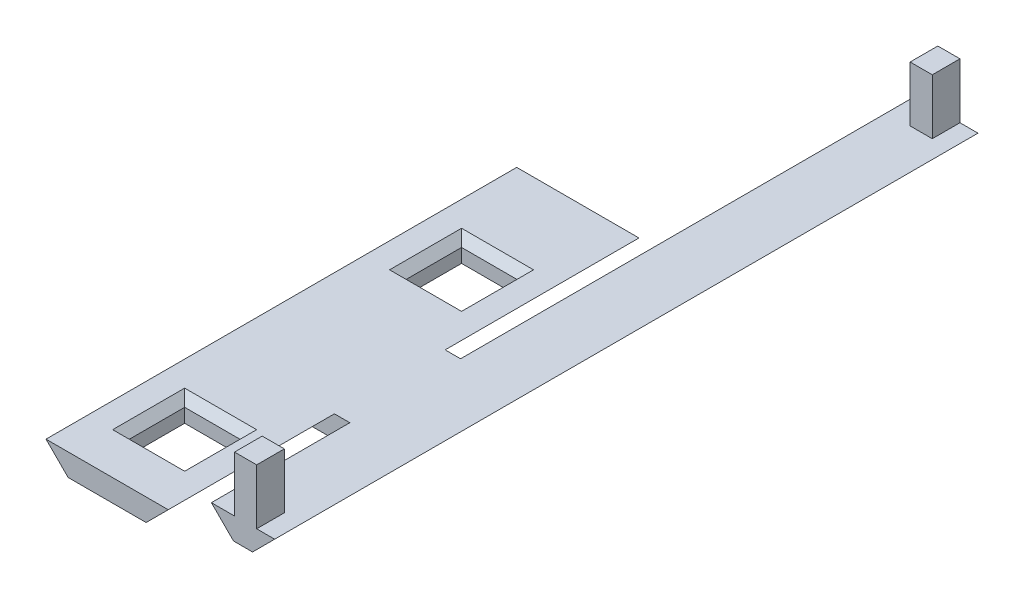
ISO-10303-21;
HEADER;
FILE_DESCRIPTION(('STEP AP214'),'2;1');
FILE_NAME('part.step','',(''),(''),'','','');
FILE_SCHEMA(('AUTOMOTIVE_DESIGN { 1 0 10303 214 1 1 1 1 }'));
ENDSEC;
DATA;
#1=APPLICATION_CONTEXT('core data for automotive mechanical design processes');
#2=APPLICATION_PROTOCOL_DEFINITION('international standard','automotive_design',2000,#1);
#3=PRODUCT_CONTEXT('',#1,'mechanical');
#4=PRODUCT('Part','Part','',(#3));
#5=PRODUCT_RELATED_PRODUCT_CATEGORY('part','',(#4));
#6=PRODUCT_DEFINITION_FORMATION('','',#4);
#7=PRODUCT_DEFINITION_CONTEXT('part definition',#1,'design');
#8=PRODUCT_DEFINITION('design','',#6,#7);
#9=PRODUCT_DEFINITION_SHAPE('','',#8);
#10=(LENGTH_UNIT() NAMED_UNIT(*) SI_UNIT(.MILLI.,.METRE.));
#11=(NAMED_UNIT(*) PLANE_ANGLE_UNIT() SI_UNIT($,.RADIAN.));
#12=(NAMED_UNIT(*) SI_UNIT($,.STERADIAN.) SOLID_ANGLE_UNIT());
#13=UNCERTAINTY_MEASURE_WITH_UNIT(LENGTH_MEASURE(1.E-05),#10,'distance_accuracy_value','');
#14=(GEOMETRIC_REPRESENTATION_CONTEXT(3) GLOBAL_UNCERTAINTY_ASSIGNED_CONTEXT((#13)) GLOBAL_UNIT_ASSIGNED_CONTEXT((#10,
#11,#12)) REPRESENTATION_CONTEXT('',''));
#15=CARTESIAN_POINT('',(0.,0.,0.));
#16=DIRECTION('',(0.,0.,1.));
#17=DIRECTION('',(1.,0.,0.));
#18=AXIS2_PLACEMENT_3D('',#15,#16,#17);
#19=CARTESIAN_POINT('',(0.,4.,85.));
#20=DIRECTION('',(0.,1.,0.));
#21=DIRECTION('',(-1.,0.,0.));
#22=AXIS2_PLACEMENT_3D('',#19,#20,#21);
#23=PLANE('',#22);
#24=DIRECTION('',(1.,0.,0.));
#25=VECTOR('',#24,1.);
#26=CARTESIAN_POINT('',(5.46065409578525,4.,14.5));
#27=LINE('',#26,#25);
#28=CARTESIAN_POINT('',(-6.0393459042148,4.,14.5));
#29=VERTEX_POINT('',#28);
#30=CARTESIAN_POINT('',(6.96065409578529,4.,14.5));
#31=VERTEX_POINT('',#30);
#32=EDGE_CURVE('E460',#29,#31,#27,.T.);
#33=ORIENTED_EDGE('',*,*,#32,.T.);
#34=DIRECTION('',(0.,0.,1.));
#35=VECTOR('',#34,1.);
#36=CARTESIAN_POINT('',(6.96065409578529,4.,26.));
#37=LINE('',#36,#35);
#38=CARTESIAN_POINT('',(6.96065409578529,4.,27.5));
#39=VERTEX_POINT('',#38);
#40=EDGE_CURVE('E462',#31,#39,#37,.T.);
#41=ORIENTED_EDGE('',*,*,#40,.T.);
#42=DIRECTION('',(-1.,0.,0.));
#43=VECTOR('',#42,1.);
#44=CARTESIAN_POINT('',(-4.53934590421476,4.,27.5));
#45=LINE('',#44,#43);
#46=CARTESIAN_POINT('',(-6.0393459042148,4.,27.5));
#47=VERTEX_POINT('',#46);
#48=EDGE_CURVE('E456',#39,#47,#45,.T.);
#49=ORIENTED_EDGE('',*,*,#48,.T.);
#50=DIRECTION('',(0.,0.,-1.));
#51=VECTOR('',#50,1.);
#52=CARTESIAN_POINT('',(-6.0393459042148,4.,16.));
#53=LINE('',#52,#51);
#54=EDGE_CURVE('E458',#47,#29,#53,.T.);
#55=ORIENTED_EDGE('',*,*,#54,.T.);
#56=EDGE_LOOP('',(#33,#41,#49,#55));
#57=FACE_BOUND('',#56,.T.);
#58=DIRECTION('',(0.,0.,-1.));
#59=VECTOR('',#58,1.);
#60=CARTESIAN_POINT('',(-6.03934590421478,4.,66.));
#61=LINE('',#60,#59);
#62=CARTESIAN_POINT('',(-6.03934590421478,4.,77.5));
#63=VERTEX_POINT('',#62);
#64=CARTESIAN_POINT('',(-6.03934590421478,4.,64.5));
#65=VERTEX_POINT('',#64);
#66=EDGE_CURVE('E447',#63,#65,#61,.T.);
#67=ORIENTED_EDGE('',*,*,#66,.T.);
#68=DIRECTION('',(1.,0.,0.));
#69=VECTOR('',#68,1.);
#70=CARTESIAN_POINT('',(5.46065409578524,4.,64.5));
#71=LINE('',#70,#69);
#72=CARTESIAN_POINT('',(6.96065409578526,4.,64.5));
#73=VERTEX_POINT('',#72);
#74=EDGE_CURVE('E453',#65,#73,#71,.T.);
#75=ORIENTED_EDGE('',*,*,#74,.T.);
#76=DIRECTION('',(0.,0.,1.));
#77=VECTOR('',#76,1.);
#78=CARTESIAN_POINT('',(6.96065409578525,4.,76.));
#79=LINE('',#78,#77);
#80=CARTESIAN_POINT('',(6.96065409578525,4.,77.5));
#81=VERTEX_POINT('',#80);
#82=EDGE_CURVE('E451',#73,#81,#79,.T.);
#83=ORIENTED_EDGE('',*,*,#82,.T.);
#84=DIRECTION('',(-1.,0.,0.));
#85=VECTOR('',#84,1.);
#86=CARTESIAN_POINT('',(-4.53934590421476,4.,77.5));
#87=LINE('',#86,#85);
#88=EDGE_CURVE('E449',#81,#63,#87,.T.);
#89=ORIENTED_EDGE('',*,*,#88,.T.);
#90=EDGE_LOOP('',(#67,#75,#83,#89));
#91=FACE_BOUND('',#90,.T.);
#92=DIRECTION('',(1.,0.,0.));
#93=VECTOR('',#92,1.);
#94=CARTESIAN_POINT('',(22.4606540957852,4.,-42.));
#95=LINE('',#94,#93);
#96=CARTESIAN_POINT('',(18.4606540957852,4.,-42.));
#97=VERTEX_POINT('',#96);
#98=CARTESIAN_POINT('',(22.4606540957852,4.,-42.));
#99=VERTEX_POINT('',#98);
#100=EDGE_CURVE('E961',#97,#99,#95,.T.);
#101=ORIENTED_EDGE('',*,*,#100,.F.);
#102=DIRECTION('',(0.,0.,1.));
#103=VECTOR('',#102,1.);
#104=CARTESIAN_POINT('',(18.4606540957852,4.,-42.));
#105=LINE('',#104,#103);
#106=CARTESIAN_POINT('',(18.4606540957852,4.,-47.));
#107=VERTEX_POINT('',#106);
#108=EDGE_CURVE('E275',#107,#97,#105,.T.);
#109=ORIENTED_EDGE('',*,*,#108,.F.);
#110=DIRECTION('',(1.,0.,0.));
#111=VECTOR('',#110,1.);
#112=CARTESIAN_POINT('',(0.,4.,-47.));
#113=LINE('',#112,#111);
#114=CARTESIAN_POINT('',(14.2828427124745,4.,-47.));
#115=VERTEX_POINT('',#114);
#116=EDGE_CURVE('E327',#115,#107,#113,.T.);
#117=ORIENTED_EDGE('',*,*,#116,.F.);
#118=DIRECTION('',(0.,0.,1.));
#119=VECTOR('',#118,1.);
#120=CARTESIAN_POINT('',(14.2828427124745,4.,-47.));
#121=LINE('',#120,#119);
#122=CARTESIAN_POINT('',(14.2828427124745,4.,35.));
#123=VERTEX_POINT('',#122);
#124=EDGE_CURVE('E344',#115,#123,#121,.T.);
#125=ORIENTED_EDGE('',*,*,#124,.T.);
#126=DIRECTION('',(1.,0.,0.));
#127=VECTOR('',#126,1.);
#128=CARTESIAN_POINT('',(7.5,4.,35.));
#129=LINE('',#128,#127);
#130=CARTESIAN_POINT('',(11.5,4.,35.));
#131=VERTEX_POINT('',#130);
#132=EDGE_CURVE('E356',#131,#123,#129,.T.);
#133=ORIENTED_EDGE('',*,*,#132,.F.);
#134=DIRECTION('',(0.,0.,-1.));
#135=VECTOR('',#134,1.);
#136=CARTESIAN_POINT('',(11.5,4.,85.));
#137=LINE('',#136,#135);
#138=CARTESIAN_POINT('',(11.5,4.,0.));
#139=VERTEX_POINT('',#138);
#140=EDGE_CURVE('E437',#131,#139,#137,.T.);
#141=ORIENTED_EDGE('',*,*,#140,.T.);
#142=DIRECTION('',(1.,0.,0.));
#143=VECTOR('',#142,1.);
#144=CARTESIAN_POINT('',(0.,4.,0.));
#145=LINE('',#144,#143);
#146=CARTESIAN_POINT('',(-10.5786918084295,4.,0.));
#147=VERTEX_POINT('',#146);
#148=EDGE_CURVE('E429',#147,#139,#145,.T.);
#149=ORIENTED_EDGE('',*,*,#148,.F.);
#150=DIRECTION('',(0.,0.,-1.));
#151=VECTOR('',#150,1.);
#152=CARTESIAN_POINT('',(-10.5786918084295,4.,85.));
#153=LINE('',#152,#151);
#154=CARTESIAN_POINT('',(-10.5786918084295,4.,85.));
#155=VERTEX_POINT('',#154);
#156=EDGE_CURVE('E435',#155,#147,#153,.T.);
#157=ORIENTED_EDGE('',*,*,#156,.F.);
#158=DIRECTION('',(1.,0.,0.));
#159=VECTOR('',#158,1.);
#160=CARTESIAN_POINT('',(0.,4.,85.));
#161=LINE('',#160,#159);
#162=CARTESIAN_POINT('',(11.5,4.,85.));
#163=VERTEX_POINT('',#162);
#164=EDGE_CURVE('E418',#155,#163,#161,.T.);
#165=ORIENTED_EDGE('',*,*,#164,.T.);
#166=CARTESIAN_POINT('',(11.5,4.,55.));
#167=VERTEX_POINT('',#166);
#168=EDGE_CURVE('E438',#163,#167,#137,.T.);
#169=ORIENTED_EDGE('',*,*,#168,.T.);
#170=DIRECTION('',(-1.,0.,0.));
#171=VECTOR('',#170,1.);
#172=CARTESIAN_POINT('',(7.5,4.,55.));
#173=LINE('',#172,#171);
#174=CARTESIAN_POINT('',(14.2828427124745,4.,55.));
#175=VERTEX_POINT('',#174);
#176=EDGE_CURVE('E358',#175,#167,#173,.T.);
#177=ORIENTED_EDGE('',*,*,#176,.F.);
#178=CARTESIAN_POINT('',(14.2828427124745,4.,80.));
#179=VERTEX_POINT('',#178);
#180=EDGE_CURVE('E347',#175,#179,#121,.T.);
#181=ORIENTED_EDGE('',*,*,#180,.T.);
#182=DIRECTION('',(1.,0.,0.));
#183=VECTOR('',#182,1.);
#184=CARTESIAN_POINT('',(0.,4.,80.));
#185=LINE('',#184,#183);
#186=CARTESIAN_POINT('',(18.4606540957852,4.,80.));
#187=VERTEX_POINT('',#186);
#188=EDGE_CURVE('E316',#179,#187,#185,.T.);
#189=ORIENTED_EDGE('',*,*,#188,.T.);
#190=DIRECTION('',(0.,0.,-1.));
#191=VECTOR('',#190,1.);
#192=CARTESIAN_POINT('',(18.4606540957852,4.,0.));
#193=LINE('',#192,#191);
#194=CARTESIAN_POINT('',(18.4606540957852,4.,75.));
#195=VERTEX_POINT('',#194);
#196=EDGE_CURVE('E290',#187,#195,#193,.T.);
#197=ORIENTED_EDGE('',*,*,#196,.T.);
#198=DIRECTION('',(1.,0.,0.));
#199=VECTOR('',#198,1.);
#200=CARTESIAN_POINT('',(0.,4.,75.));
#201=LINE('',#200,#199);
#202=CARTESIAN_POINT('',(22.4606540957852,4.,75.));
#203=VERTEX_POINT('',#202);
#204=EDGE_CURVE('E280',#195,#203,#201,.T.);
#205=ORIENTED_EDGE('',*,*,#204,.T.);
#206=DIRECTION('',(0.,0.,-1.));
#207=VECTOR('',#206,1.);
#208=CARTESIAN_POINT('',(22.4606540957851,4.,0.));
#209=LINE('',#208,#207);
#210=CARTESIAN_POINT('',(22.4606540957852,4.,80.));
#211=VERTEX_POINT('',#210);
#212=EDGE_CURVE('E277',#211,#203,#209,.T.);
#213=ORIENTED_EDGE('',*,*,#212,.F.);
#214=CARTESIAN_POINT('',(25.7171572875254,4.,80.));
#215=VERTEX_POINT('',#214);
#216=EDGE_CURVE('E315',#211,#215,#185,.T.);
#217=ORIENTED_EDGE('',*,*,#216,.T.);
#218=DIRECTION('',(0.,0.,1.));
#219=VECTOR('',#218,1.);
#220=CARTESIAN_POINT('',(25.7171572875254,4.,-47.));
#221=LINE('',#220,#219);
#222=CARTESIAN_POINT('',(25.7171572875254,4.,-47.));
#223=VERTEX_POINT('',#222);
#224=EDGE_CURVE('E336',#223,#215,#221,.T.);
#225=ORIENTED_EDGE('',*,*,#224,.F.);
#226=CARTESIAN_POINT('',(22.4606540957852,4.,-47.));
#227=VERTEX_POINT('',#226);
#228=EDGE_CURVE('E326',#227,#223,#113,.T.);
#229=ORIENTED_EDGE('',*,*,#228,.F.);
#230=DIRECTION('',(0.,0.,-1.));
#231=VECTOR('',#230,1.);
#232=CARTESIAN_POINT('',(22.4606540957852,4.,-42.));
#233=LINE('',#232,#231);
#234=EDGE_CURVE('E271',#99,#227,#233,.T.);
#235=ORIENTED_EDGE('',*,*,#234,.F.);
#236=EDGE_LOOP('',(#101,#109,#117,#125,#133,#141,#149,#157,#165,#169,#177,#181,#189,#197,#205,
#213,#217,#225,#229,#235));
#237=FACE_BOUND('',#236,.T.);
#238=ADVANCED_FACE('F43',(#57,#91,#237),#23,.T.);
#239=CARTESIAN_POINT('',(3.75000000000001,-3.75,85.));
#240=DIRECTION('',(-0.707106781186549,0.707106781186546,0.));
#241=DIRECTION('',(-0.707106781186546,-0.707106781186549,0.));
#242=AXIS2_PLACEMENT_3D('',#239,#240,#241);
#243=PLANE('',#242);
#244=DIRECTION('',(0.,0.,-1.));
#245=VECTOR('',#244,1.);
#246=CARTESIAN_POINT('',(7.5,0.,85.));
#247=LINE('',#246,#245);
#248=CARTESIAN_POINT('',(7.5,0.,85.));
#249=VERTEX_POINT('',#248);
#250=CARTESIAN_POINT('',(7.5,0.,55.));
#251=VERTEX_POINT('',#250);
#252=EDGE_CURVE('E442',#249,#251,#247,.T.);
#253=ORIENTED_EDGE('',*,*,#252,.T.);
#254=DIRECTION('',(0.707106781186546,0.707106781186549,0.));
#255=VECTOR('',#254,1.);
#256=CARTESIAN_POINT('',(3.75000000000001,-3.75,55.));
#257=LINE('',#256,#255);
#258=EDGE_CURVE('E368',#251,#167,#257,.T.);
#259=ORIENTED_EDGE('',*,*,#258,.T.);
#260=ORIENTED_EDGE('',*,*,#168,.F.);
#261=DIRECTION('',(0.707106781186546,0.707106781186549,0.));
#262=VECTOR('',#261,1.);
#263=CARTESIAN_POINT('',(3.75000000000001,-3.75,85.));
#264=LINE('',#263,#262);
#265=EDGE_CURVE('E415',#249,#163,#264,.T.);
#266=ORIENTED_EDGE('',*,*,#265,.F.);
#267=EDGE_LOOP('',(#253,#259,#260,#266));
#268=FACE_BOUND('',#267,.T.);
#269=ADVANCED_FACE('F539',(#268),#243,.F.);
#270=CARTESIAN_POINT('',(0.,0.,85.));
#271=DIRECTION('',(0.,-1.,0.));
#272=DIRECTION('',(0.,0.,-1.));
#273=AXIS2_PLACEMENT_3D('',#270,#271,#272);
#274=PLANE('',#273);
#275=DIRECTION('',(0.,0.,1.));
#276=VECTOR('',#275,1.);
#277=CARTESIAN_POINT('',(5.46065409578525,0.,26.));
#278=LINE('',#277,#276);
#279=CARTESIAN_POINT('',(5.46065409578525,0.,16.));
#280=VERTEX_POINT('',#279);
#281=CARTESIAN_POINT('',(5.46065409578525,0.,26.));
#282=VERTEX_POINT('',#281);
#283=EDGE_CURVE('E372',#280,#282,#278,.T.);
#284=ORIENTED_EDGE('',*,*,#283,.F.);
#285=DIRECTION('',(1.,0.,0.));
#286=VECTOR('',#285,1.);
#287=CARTESIAN_POINT('',(-4.53934590421475,0.,16.));
#288=LINE('',#287,#286);
#289=CARTESIAN_POINT('',(-4.53934590421475,0.,16.));
#290=VERTEX_POINT('',#289);
#291=EDGE_CURVE('E382',#290,#280,#288,.T.);
#292=ORIENTED_EDGE('',*,*,#291,.F.);
#293=DIRECTION('',(0.,0.,-1.));
#294=VECTOR('',#293,1.);
#295=CARTESIAN_POINT('',(-4.53934590421476,0.,26.));
#296=LINE('',#295,#294);
#297=CARTESIAN_POINT('',(-4.53934590421476,0.,26.));
#298=VERTEX_POINT('',#297);
#299=EDGE_CURVE('E379',#298,#290,#296,.T.);
#300=ORIENTED_EDGE('',*,*,#299,.F.);
#301=DIRECTION('',(-1.,0.,0.));
#302=VECTOR('',#301,1.);
#303=CARTESIAN_POINT('',(-4.53934590421476,0.,26.));
#304=LINE('',#303,#302);
#305=EDGE_CURVE('E375',#282,#298,#304,.T.);
#306=ORIENTED_EDGE('',*,*,#305,.F.);
#307=EDGE_LOOP('',(#284,#292,#300,#306));
#308=FACE_BOUND('',#307,.T.);
#309=DIRECTION('',(0.,0.,1.));
#310=VECTOR('',#309,1.);
#311=CARTESIAN_POINT('',(5.46065409578524,0.,76.));
#312=LINE('',#311,#310);
#313=CARTESIAN_POINT('',(5.46065409578524,0.,66.));
#314=VERTEX_POINT('',#313);
#315=CARTESIAN_POINT('',(5.46065409578524,0.,76.));
#316=VERTEX_POINT('',#315);
#317=EDGE_CURVE('E376',#314,#316,#312,.T.);
#318=ORIENTED_EDGE('',*,*,#317,.F.);
#319=DIRECTION('',(1.,0.,0.));
#320=VECTOR('',#319,1.);
#321=CARTESIAN_POINT('',(-4.53934590421476,0.,66.));
#322=LINE('',#321,#320);
#323=CARTESIAN_POINT('',(-4.53934590421476,0.,66.));
#324=VERTEX_POINT('',#323);
#325=EDGE_CURVE('E396',#324,#314,#322,.T.);
#326=ORIENTED_EDGE('',*,*,#325,.F.);
#327=DIRECTION('',(0.,0.,-1.));
#328=VECTOR('',#327,1.);
#329=CARTESIAN_POINT('',(-4.53934590421476,0.,76.));
#330=LINE('',#329,#328);
#331=CARTESIAN_POINT('',(-4.53934590421476,0.,76.));
#332=VERTEX_POINT('',#331);
#333=EDGE_CURVE('E404',#332,#324,#330,.T.);
#334=ORIENTED_EDGE('',*,*,#333,.F.);
#335=DIRECTION('',(-1.,0.,0.));
#336=VECTOR('',#335,1.);
#337=CARTESIAN_POINT('',(-4.53934590421476,0.,76.));
#338=LINE('',#337,#336);
#339=EDGE_CURVE('E407',#316,#332,#338,.T.);
#340=ORIENTED_EDGE('',*,*,#339,.F.);
#341=EDGE_LOOP('',(#318,#326,#334,#340));
#342=FACE_BOUND('',#341,.T.);
#343=DIRECTION('',(-1.,0.,0.));
#344=VECTOR('',#343,1.);
#345=CARTESIAN_POINT('',(0.,0.,0.));
#346=LINE('',#345,#344);
#347=CARTESIAN_POINT('',(7.5,0.,0.));
#348=VERTEX_POINT('',#347);
#349=CARTESIAN_POINT('',(-6.57869180842953,0.,0.));
#350=VERTEX_POINT('',#349);
#351=EDGE_CURVE('E388',#348,#350,#346,.T.);
#352=ORIENTED_EDGE('',*,*,#351,.F.);
#353=CARTESIAN_POINT('',(7.5,0.,35.));
#354=VERTEX_POINT('',#353);
#355=EDGE_CURVE('E441',#354,#348,#247,.T.);
#356=ORIENTED_EDGE('',*,*,#355,.F.);
#357=DIRECTION('',(1.,0.,0.));
#358=VECTOR('',#357,1.);
#359=CARTESIAN_POINT('',(7.5,0.,35.));
#360=LINE('',#359,#358);
#361=CARTESIAN_POINT('',(18.2828427124746,0.,35.));
#362=VERTEX_POINT('',#361);
#363=EDGE_CURVE('E355',#354,#362,#360,.T.);
#364=ORIENTED_EDGE('',*,*,#363,.T.);
#365=DIRECTION('',(0.,0.,1.));
#366=VECTOR('',#365,1.);
#367=CARTESIAN_POINT('',(18.2828427124746,0.,-47.));
#368=LINE('',#367,#366);
#369=CARTESIAN_POINT('',(18.2828427124746,0.,-47.));
#370=VERTEX_POINT('',#369);
#371=EDGE_CURVE('E340',#370,#362,#368,.T.);
#372=ORIENTED_EDGE('',*,*,#371,.F.);
#373=DIRECTION('',(1.,0.,0.));
#374=VECTOR('',#373,1.);
#375=CARTESIAN_POINT('',(0.,0.,-47.));
#376=LINE('',#375,#374);
#377=CARTESIAN_POINT('',(21.7171572875254,0.,-47.));
#378=VERTEX_POINT('',#377);
#379=EDGE_CURVE('E333',#370,#378,#376,.T.);
#380=ORIENTED_EDGE('',*,*,#379,.T.);
#381=DIRECTION('',(0.,0.,1.));
#382=VECTOR('',#381,1.);
#383=CARTESIAN_POINT('',(21.7171572875254,0.,-47.));
#384=LINE('',#383,#382);
#385=CARTESIAN_POINT('',(21.7171572875254,0.,80.));
#386=VERTEX_POINT('',#385);
#387=EDGE_CURVE('E337',#378,#386,#384,.T.);
#388=ORIENTED_EDGE('',*,*,#387,.T.);
#389=DIRECTION('',(1.,0.,0.));
#390=VECTOR('',#389,1.);
#391=CARTESIAN_POINT('',(0.,0.,80.));
#392=LINE('',#391,#390);
#393=CARTESIAN_POINT('',(18.2828427124746,0.,80.));
#394=VERTEX_POINT('',#393);
#395=EDGE_CURVE('E321',#394,#386,#392,.T.);
#396=ORIENTED_EDGE('',*,*,#395,.F.);
#397=CARTESIAN_POINT('',(18.2828427124746,0.,55.));
#398=VERTEX_POINT('',#397);
#399=EDGE_CURVE('E343',#398,#394,#368,.T.);
#400=ORIENTED_EDGE('',*,*,#399,.F.);
#401=DIRECTION('',(-1.,0.,0.));
#402=VECTOR('',#401,1.);
#403=CARTESIAN_POINT('',(7.5,0.,55.));
#404=LINE('',#403,#402);
#405=EDGE_CURVE('E359',#398,#251,#404,.T.);
#406=ORIENTED_EDGE('',*,*,#405,.T.);
#407=ORIENTED_EDGE('',*,*,#252,.F.);
#408=DIRECTION('',(-1.,0.,0.));
#409=VECTOR('',#408,1.);
#410=CARTESIAN_POINT('',(0.,0.,85.));
#411=LINE('',#410,#409);
#412=CARTESIAN_POINT('',(-6.57869180842953,0.,85.));
#413=VERTEX_POINT('',#412);
#414=EDGE_CURVE('E412',#249,#413,#411,.T.);
#415=ORIENTED_EDGE('',*,*,#414,.T.);
#416=DIRECTION('',(0.,0.,-1.));
#417=VECTOR('',#416,1.);
#418=CARTESIAN_POINT('',(-6.57869180842953,0.,85.));
#419=LINE('',#418,#417);
#420=EDGE_CURVE('E423',#413,#350,#419,.T.);
#421=ORIENTED_EDGE('',*,*,#420,.T.);
#422=EDGE_LOOP('',(#352,#356,#364,#372,#380,#388,#396,#400,#406,#407,#415,#421));
#423=FACE_BOUND('',#422,.T.);
#424=ADVANCED_FACE('F521',(#308,#342,#423),#274,.T.);
#425=ORIENTED_EDGE('',*,*,#140,.F.);
#426=DIRECTION('',(-0.707106781186546,-0.707106781186549,0.));
#427=VECTOR('',#426,1.);
#428=CARTESIAN_POINT('',(3.75000000000001,-3.75,35.));
#429=LINE('',#428,#427);
#430=EDGE_CURVE('E361',#131,#354,#429,.T.);
#431=ORIENTED_EDGE('',*,*,#430,.T.);
#432=ORIENTED_EDGE('',*,*,#355,.T.);
#433=DIRECTION('',(0.707106781186546,0.707106781186549,0.));
#434=VECTOR('',#433,1.);
#435=CARTESIAN_POINT('',(3.75000000000001,-3.75,0.));
#436=LINE('',#435,#434);
#437=EDGE_CURVE('E426',#348,#139,#436,.T.);
#438=ORIENTED_EDGE('',*,*,#437,.T.);
#439=EDGE_LOOP('',(#425,#431,#432,#438));
#440=FACE_BOUND('',#439,.T.);
#441=ADVANCED_FACE('F549',(#440),#243,.F.);
#442=CARTESIAN_POINT('',(-3.28934590421477,-3.28934590421476,85.));
#443=DIRECTION('',(0.707106781186549,0.707106781186546,0.));
#444=DIRECTION('',(-0.707106781186546,0.707106781186549,0.));
#445=AXIS2_PLACEMENT_3D('',#442,#443,#444);
#446=PLANE('',#445);
#447=DIRECTION('',(0.707106781186546,-0.707106781186549,0.));
#448=VECTOR('',#447,1.);
#449=CARTESIAN_POINT('',(-3.28934590421477,-3.28934590421476,0.));
#450=LINE('',#449,#448);
#451=EDGE_CURVE('E416',#147,#350,#450,.T.);
#452=ORIENTED_EDGE('',*,*,#451,.T.);
#453=ORIENTED_EDGE('',*,*,#420,.F.);
#454=DIRECTION('',(0.707106781186546,-0.707106781186549,0.));
#455=VECTOR('',#454,1.);
#456=CARTESIAN_POINT('',(-3.28934590421477,-3.28934590421476,85.));
#457=LINE('',#456,#455);
#458=EDGE_CURVE('E421',#155,#413,#457,.T.);
#459=ORIENTED_EDGE('',*,*,#458,.F.);
#460=ORIENTED_EDGE('',*,*,#156,.T.);
#461=EDGE_LOOP('',(#452,#453,#459,#460));
#462=FACE_BOUND('',#461,.T.);
#463=ADVANCED_FACE('F551',(#462),#446,.F.);
#464=CARTESIAN_POINT('',(0.,0.,85.));
#465=DIRECTION('',(0.,0.,1.));
#466=DIRECTION('',(1.,0.,0.));
#467=AXIS2_PLACEMENT_3D('',#464,#465,#466);
#468=PLANE('',#467);
#469=ORIENTED_EDGE('',*,*,#414,.F.);
#470=ORIENTED_EDGE('',*,*,#265,.T.);
#471=ORIENTED_EDGE('',*,*,#164,.F.);
#472=ORIENTED_EDGE('',*,*,#458,.T.);
#473=EDGE_LOOP('',(#469,#470,#471,#472));
#474=FACE_BOUND('',#473,.T.);
#475=ADVANCED_FACE('F694',(#474),#468,.T.);
#476=CARTESIAN_POINT('',(0.,0.,0.));
#477=DIRECTION('',(0.,0.,1.));
#478=DIRECTION('',(1.,0.,0.));
#479=AXIS2_PLACEMENT_3D('',#476,#477,#478);
#480=PLANE('',#479);
#481=ORIENTED_EDGE('',*,*,#351,.T.);
#482=ORIENTED_EDGE('',*,*,#451,.F.);
#483=ORIENTED_EDGE('',*,*,#148,.T.);
#484=ORIENTED_EDGE('',*,*,#437,.F.);
#485=EDGE_LOOP('',(#481,#482,#483,#484));
#486=FACE_BOUND('',#485,.T.);
#487=ADVANCED_FACE('F686',(#486),#480,.F.);
#488=CARTESIAN_POINT('',(5.46065409578524,80.,76.));
#489=DIRECTION('',(1.,0.,0.));
#490=DIRECTION('',(0.,0.,-1.));
#491=AXIS2_PLACEMENT_3D('',#488,#489,#490);
#492=PLANE('',#491);
#493=DIRECTION('',(0.,-1.,0.));
#494=VECTOR('',#493,1.);
#495=CARTESIAN_POINT('',(5.46065409578524,80.,76.));
#496=LINE('',#495,#494);
#497=CARTESIAN_POINT('',(5.46065409578524,2.49999999999999,76.));
#498=VERTEX_POINT('',#497);
#499=EDGE_CURVE('E394',#498,#316,#496,.T.);
#500=ORIENTED_EDGE('',*,*,#499,.F.);
#501=DIRECTION('',(0.,0.,-1.));
#502=VECTOR('',#501,1.);
#503=CARTESIAN_POINT('',(5.46065409578524,2.49999999999999,66.));
#504=LINE('',#503,#502);
#505=CARTESIAN_POINT('',(5.46065409578524,2.49999999999999,66.));
#506=VERTEX_POINT('',#505);
#507=EDGE_CURVE('E474',#498,#506,#504,.T.);
#508=ORIENTED_EDGE('',*,*,#507,.T.);
#509=DIRECTION('',(0.,-1.,0.));
#510=VECTOR('',#509,1.);
#511=CARTESIAN_POINT('',(5.46065409578524,80.,66.));
#512=LINE('',#511,#510);
#513=EDGE_CURVE('E371',#506,#314,#512,.T.);
#514=ORIENTED_EDGE('',*,*,#513,.T.);
#515=ORIENTED_EDGE('',*,*,#317,.T.);
#516=EDGE_LOOP('',(#500,#508,#514,#515));
#517=FACE_BOUND('',#516,.T.);
#518=ADVANCED_FACE('F524',(#517),#492,.F.);
#519=CARTESIAN_POINT('',(-4.53934590421476,80.,66.));
#520=DIRECTION('',(0.,0.,-1.));
#521=DIRECTION('',(-1.,0.,0.));
#522=AXIS2_PLACEMENT_3D('',#519,#520,#521);
#523=PLANE('',#522);
#524=ORIENTED_EDGE('',*,*,#513,.F.);
#525=DIRECTION('',(-1.,0.,0.));
#526=VECTOR('',#525,1.);
#527=CARTESIAN_POINT('',(-4.53934590421476,2.49999999999999,66.));
#528=LINE('',#527,#526);
#529=CARTESIAN_POINT('',(-4.53934590421476,2.49999999999999,66.));
#530=VERTEX_POINT('',#529);
#531=EDGE_CURVE('E471',#506,#530,#528,.T.);
#532=ORIENTED_EDGE('',*,*,#531,.T.);
#533=DIRECTION('',(0.,-1.,0.));
#534=VECTOR('',#533,1.);
#535=CARTESIAN_POINT('',(-4.53934590421476,80.,66.));
#536=LINE('',#535,#534);
#537=EDGE_CURVE('E399',#530,#324,#536,.T.);
#538=ORIENTED_EDGE('',*,*,#537,.T.);
#539=ORIENTED_EDGE('',*,*,#325,.T.);
#540=EDGE_LOOP('',(#524,#532,#538,#539));
#541=FACE_BOUND('',#540,.T.);
#542=ADVANCED_FACE('F514',(#541),#523,.F.);
#543=CARTESIAN_POINT('',(-4.53934590421476,80.,76.));
#544=DIRECTION('',(-1.,0.,0.));
#545=DIRECTION('',(0.,0.,1.));
#546=AXIS2_PLACEMENT_3D('',#543,#544,#545);
#547=PLANE('',#546);
#548=ORIENTED_EDGE('',*,*,#537,.F.);
#549=DIRECTION('',(0.,0.,1.));
#550=VECTOR('',#549,1.);
#551=CARTESIAN_POINT('',(-4.53934590421476,2.49999999999999,76.));
#552=LINE('',#551,#550);
#553=CARTESIAN_POINT('',(-4.53934590421476,2.49999999999999,76.));
#554=VERTEX_POINT('',#553);
#555=EDGE_CURVE('E11',#530,#554,#552,.T.);
#556=ORIENTED_EDGE('',*,*,#555,.T.);
#557=DIRECTION('',(0.,-1.,0.));
#558=VECTOR('',#557,1.);
#559=CARTESIAN_POINT('',(-4.53934590421476,80.,76.));
#560=LINE('',#559,#558);
#561=EDGE_CURVE('E397',#554,#332,#560,.T.);
#562=ORIENTED_EDGE('',*,*,#561,.T.);
#563=ORIENTED_EDGE('',*,*,#333,.T.);
#564=EDGE_LOOP('',(#548,#556,#562,#563));
#565=FACE_BOUND('',#564,.T.);
#566=ADVANCED_FACE('F515',(#565),#547,.F.);
#567=CARTESIAN_POINT('',(-4.53934590421476,80.,76.));
#568=DIRECTION('',(0.,0.,1.));
#569=DIRECTION('',(1.,0.,0.));
#570=AXIS2_PLACEMENT_3D('',#567,#568,#569);
#571=PLANE('',#570);
#572=ORIENTED_EDGE('',*,*,#561,.F.);
#573=DIRECTION('',(1.,0.,0.));
#574=VECTOR('',#573,1.);
#575=CARTESIAN_POINT('',(5.46065409578524,2.49999999999999,76.));
#576=LINE('',#575,#574);
#577=EDGE_CURVE('E53',#554,#498,#576,.T.);
#578=ORIENTED_EDGE('',*,*,#577,.T.);
#579=ORIENTED_EDGE('',*,*,#499,.T.);
#580=ORIENTED_EDGE('',*,*,#339,.T.);
#581=EDGE_LOOP('',(#572,#578,#579,#580));
#582=FACE_BOUND('',#581,.T.);
#583=ADVANCED_FACE('F525',(#582),#571,.F.);
#584=CARTESIAN_POINT('',(5.46065409578525,80.,26.));
#585=DIRECTION('',(1.,0.,0.));
#586=DIRECTION('',(0.,0.,-1.));
#587=AXIS2_PLACEMENT_3D('',#584,#585,#586);
#588=PLANE('',#587);
#589=DIRECTION('',(0.,-1.,0.));
#590=VECTOR('',#589,1.);
#591=CARTESIAN_POINT('',(5.46065409578525,80.,26.));
#592=LINE('',#591,#590);
#593=CARTESIAN_POINT('',(5.46065409578525,2.49999999999996,26.));
#594=VERTEX_POINT('',#593);
#595=EDGE_CURVE('E385',#594,#282,#592,.T.);
#596=ORIENTED_EDGE('',*,*,#595,.F.);
#597=DIRECTION('',(0.,0.,-1.));
#598=VECTOR('',#597,1.);
#599=CARTESIAN_POINT('',(5.46065409578525,2.49999999999996,16.));
#600=LINE('',#599,#598);
#601=CARTESIAN_POINT('',(5.46065409578525,2.49999999999996,16.));
#602=VERTEX_POINT('',#601);
#603=EDGE_CURVE('E444',#594,#602,#600,.T.);
#604=ORIENTED_EDGE('',*,*,#603,.T.);
#605=DIRECTION('',(0.,-1.,0.));
#606=VECTOR('',#605,1.);
#607=CARTESIAN_POINT('',(5.46065409578525,80.,16.));
#608=LINE('',#607,#606);
#609=EDGE_CURVE('E386',#602,#280,#608,.T.);
#610=ORIENTED_EDGE('',*,*,#609,.T.);
#611=ORIENTED_EDGE('',*,*,#283,.T.);
#612=EDGE_LOOP('',(#596,#604,#610,#611));
#613=FACE_BOUND('',#612,.T.);
#614=ADVANCED_FACE('F527',(#613),#588,.F.);
#615=CARTESIAN_POINT('',(-4.53934590421475,80.,16.));
#616=DIRECTION('',(0.,0.,-1.));
#617=DIRECTION('',(-1.,0.,0.));
#618=AXIS2_PLACEMENT_3D('',#615,#616,#617);
#619=PLANE('',#618);
#620=ORIENTED_EDGE('',*,*,#609,.F.);
#621=DIRECTION('',(-1.,0.,0.));
#622=VECTOR('',#621,1.);
#623=CARTESIAN_POINT('',(-4.53934590421475,2.49999999999996,16.));
#624=LINE('',#623,#622);
#625=CARTESIAN_POINT('',(-4.53934590421475,2.49999999999996,16.));
#626=VERTEX_POINT('',#625);
#627=EDGE_CURVE('E465',#602,#626,#624,.T.);
#628=ORIENTED_EDGE('',*,*,#627,.T.);
#629=DIRECTION('',(0.,-1.,0.));
#630=VECTOR('',#629,1.);
#631=CARTESIAN_POINT('',(-4.53934590421475,80.,16.));
#632=LINE('',#631,#630);
#633=EDGE_CURVE('E389',#626,#290,#632,.T.);
#634=ORIENTED_EDGE('',*,*,#633,.T.);
#635=ORIENTED_EDGE('',*,*,#291,.T.);
#636=EDGE_LOOP('',(#620,#628,#634,#635));
#637=FACE_BOUND('',#636,.T.);
#638=ADVANCED_FACE('F533',(#637),#619,.F.);
#639=CARTESIAN_POINT('',(-4.53934590421476,80.,26.));
#640=DIRECTION('',(-1.,0.,0.));
#641=DIRECTION('',(0.,0.,1.));
#642=AXIS2_PLACEMENT_3D('',#639,#640,#641);
#643=PLANE('',#642);
#644=ORIENTED_EDGE('',*,*,#633,.F.);
#645=DIRECTION('',(0.,0.,1.));
#646=VECTOR('',#645,1.);
#647=CARTESIAN_POINT('',(-4.53934590421476,2.49999999999996,26.));
#648=LINE('',#647,#646);
#649=CARTESIAN_POINT('',(-4.53934590421476,2.49999999999996,26.));
#650=VERTEX_POINT('',#649);
#651=EDGE_CURVE('E467',#626,#650,#648,.T.);
#652=ORIENTED_EDGE('',*,*,#651,.T.);
#653=DIRECTION('',(0.,-1.,0.));
#654=VECTOR('',#653,1.);
#655=CARTESIAN_POINT('',(-4.53934590421476,80.,26.));
#656=LINE('',#655,#654);
#657=EDGE_CURVE('E391',#650,#298,#656,.T.);
#658=ORIENTED_EDGE('',*,*,#657,.T.);
#659=ORIENTED_EDGE('',*,*,#299,.T.);
#660=EDGE_LOOP('',(#644,#652,#658,#659));
#661=FACE_BOUND('',#660,.T.);
#662=ADVANCED_FACE('F635',(#661),#643,.F.);
#663=CARTESIAN_POINT('',(-4.53934590421476,80.,26.));
#664=DIRECTION('',(0.,0.,1.));
#665=DIRECTION('',(1.,0.,0.));
#666=AXIS2_PLACEMENT_3D('',#663,#664,#665);
#667=PLANE('',#666);
#668=ORIENTED_EDGE('',*,*,#657,.F.);
#669=DIRECTION('',(1.,0.,0.));
#670=VECTOR('',#669,1.);
#671=CARTESIAN_POINT('',(5.46065409578525,2.49999999999996,26.));
#672=LINE('',#671,#670);
#673=EDGE_CURVE('E469',#650,#594,#672,.T.);
#674=ORIENTED_EDGE('',*,*,#673,.T.);
#675=ORIENTED_EDGE('',*,*,#595,.T.);
#676=ORIENTED_EDGE('',*,*,#305,.T.);
#677=EDGE_LOOP('',(#668,#674,#675,#676));
#678=FACE_BOUND('',#677,.T.);
#679=ADVANCED_FACE('F630',(#678),#667,.F.);
#680=CARTESIAN_POINT('',(7.5,4.,55.));
#681=DIRECTION('',(0.,0.,1.));
#682=DIRECTION('',(1.,0.,0.));
#683=AXIS2_PLACEMENT_3D('',#680,#681,#682);
#684=PLANE('',#683);
#685=DIRECTION('',(0.707106781186551,-0.707106781186545,0.));
#686=VECTOR('',#685,1.);
#687=CARTESIAN_POINT('',(10.8914213562372,7.39142135623727,55.));
#688=LINE('',#687,#686);
#689=EDGE_CURVE('E352',#175,#398,#688,.T.);
#690=ORIENTED_EDGE('',*,*,#689,.F.);
#691=ORIENTED_EDGE('',*,*,#176,.T.);
#692=ORIENTED_EDGE('',*,*,#258,.F.);
#693=ORIENTED_EDGE('',*,*,#405,.F.);
#694=EDGE_LOOP('',(#690,#691,#692,#693));
#695=FACE_BOUND('',#694,.T.);
#696=ADVANCED_FACE('F634',(#695),#684,.T.);
#697=CARTESIAN_POINT('',(7.5,4.,35.));
#698=DIRECTION('',(0.,0.,-1.));
#699=DIRECTION('',(-1.,0.,0.));
#700=AXIS2_PLACEMENT_3D('',#697,#698,#699);
#701=PLANE('',#700);
#702=DIRECTION('',(-0.707106781186551,0.707106781186545,0.));
#703=VECTOR('',#702,1.);
#704=CARTESIAN_POINT('',(10.8914213562372,7.39142135623727,35.));
#705=LINE('',#704,#703);
#706=EDGE_CURVE('E339',#362,#123,#705,.T.);
#707=ORIENTED_EDGE('',*,*,#706,.F.);
#708=ORIENTED_EDGE('',*,*,#363,.F.);
#709=ORIENTED_EDGE('',*,*,#430,.F.);
#710=ORIENTED_EDGE('',*,*,#132,.T.);
#711=EDGE_LOOP('',(#707,#708,#709,#710));
#712=FACE_BOUND('',#711,.T.);
#713=ADVANCED_FACE('F723',(#712),#701,.T.);
#714=CARTESIAN_POINT('',(9.14142135623721,9.14142135623728,-47.));
#715=DIRECTION('',(-0.707106781186544,-0.70710678118655,0.));
#716=DIRECTION('',(0.707106781186551,-0.707106781186545,0.));
#717=AXIS2_PLACEMENT_3D('',#714,#715,#716);
#718=PLANE('',#717);
#719=ORIENTED_EDGE('',*,*,#180,.F.);
#720=ORIENTED_EDGE('',*,*,#689,.T.);
#721=ORIENTED_EDGE('',*,*,#399,.T.);
#722=DIRECTION('',(0.707106781186551,-0.707106781186545,0.));
#723=VECTOR('',#722,1.);
#724=CARTESIAN_POINT('',(9.14142135623721,9.14142135623728,80.));
#725=LINE('',#724,#723);
#726=EDGE_CURVE('E318',#179,#394,#725,.T.);
#727=ORIENTED_EDGE('',*,*,#726,.F.);
#728=EDGE_LOOP('',(#719,#720,#721,#727));
#729=FACE_BOUND('',#728,.T.);
#730=ADVANCED_FACE('F732',(#729),#718,.T.);
#731=CARTESIAN_POINT('',(10.8585786437626,-10.8585786437627,-47.));
#732=DIRECTION('',(-0.707106781186545,0.70710678118655,0.));
#733=DIRECTION('',(-0.70710678118655,-0.707106781186545,0.));
#734=AXIS2_PLACEMENT_3D('',#731,#732,#733);
#735=PLANE('',#734);
#736=ORIENTED_EDGE('',*,*,#224,.T.);
#737=DIRECTION('',(-0.70710678118655,-0.707106781186545,0.));
#738=VECTOR('',#737,1.);
#739=CARTESIAN_POINT('',(10.8585786437626,-10.8585786437627,80.));
#740=LINE('',#739,#738);
#741=EDGE_CURVE('E312',#215,#386,#740,.T.);
#742=ORIENTED_EDGE('',*,*,#741,.T.);
#743=ORIENTED_EDGE('',*,*,#387,.F.);
#744=DIRECTION('',(-0.70710678118655,-0.707106781186545,0.));
#745=VECTOR('',#744,1.);
#746=CARTESIAN_POINT('',(10.8585786437626,-10.8585786437627,-47.));
#747=LINE('',#746,#745);
#748=EDGE_CURVE('E324',#223,#378,#747,.T.);
#749=ORIENTED_EDGE('',*,*,#748,.F.);
#750=EDGE_LOOP('',(#736,#742,#743,#749));
#751=FACE_BOUND('',#750,.T.);
#752=ADVANCED_FACE('F742',(#751),#735,.F.);
#753=ORIENTED_EDGE('',*,*,#371,.T.);
#754=ORIENTED_EDGE('',*,*,#706,.T.);
#755=ORIENTED_EDGE('',*,*,#124,.F.);
#756=DIRECTION('',(0.707106781186551,-0.707106781186545,0.));
#757=VECTOR('',#756,1.);
#758=CARTESIAN_POINT('',(9.14142135623721,9.14142135623728,-47.));
#759=LINE('',#758,#757);
#760=EDGE_CURVE('E330',#115,#370,#759,.T.);
#761=ORIENTED_EDGE('',*,*,#760,.T.);
#762=EDGE_LOOP('',(#753,#754,#755,#761));
#763=FACE_BOUND('',#762,.T.);
#764=ADVANCED_FACE('F745',(#763),#718,.T.);
#765=CARTESIAN_POINT('',(0.,0.,-47.));
#766=DIRECTION('',(0.,0.,1.));
#767=DIRECTION('',(1.,0.,0.));
#768=AXIS2_PLACEMENT_3D('',#765,#766,#767);
#769=PLANE('',#768);
#770=ORIENTED_EDGE('',*,*,#748,.T.);
#771=ORIENTED_EDGE('',*,*,#379,.F.);
#772=ORIENTED_EDGE('',*,*,#760,.F.);
#773=ORIENTED_EDGE('',*,*,#116,.T.);
#774=DIRECTION('',(0.,-1.,0.));
#775=VECTOR('',#774,1.);
#776=CARTESIAN_POINT('',(18.4606540957852,14.,-47.));
#777=LINE('',#776,#775);
#778=CARTESIAN_POINT('',(18.4606540957852,14.,-47.));
#779=VERTEX_POINT('',#778);
#780=EDGE_CURVE('E960',#779,#107,#777,.T.);
#781=ORIENTED_EDGE('',*,*,#780,.F.);
#782=DIRECTION('',(-1.,0.,0.));
#783=VECTOR('',#782,1.);
#784=CARTESIAN_POINT('',(22.4606540957852,14.,-47.));
#785=LINE('',#784,#783);
#786=CARTESIAN_POINT('',(22.4606540957852,14.,-47.));
#787=VERTEX_POINT('',#786);
#788=EDGE_CURVE('E268',#787,#779,#785,.T.);
#789=ORIENTED_EDGE('',*,*,#788,.F.);
#790=DIRECTION('',(0.,-1.,0.));
#791=VECTOR('',#790,1.);
#792=CARTESIAN_POINT('',(22.4606540957852,14.,-47.));
#793=LINE('',#792,#791);
#794=EDGE_CURVE('E282',#787,#227,#793,.T.);
#795=ORIENTED_EDGE('',*,*,#794,.T.);
#796=ORIENTED_EDGE('',*,*,#228,.T.);
#797=EDGE_LOOP('',(#770,#771,#772,#773,#781,#789,#795,#796));
#798=FACE_BOUND('',#797,.T.);
#799=ADVANCED_FACE('F758',(#798),#769,.F.);
#800=CARTESIAN_POINT('',(0.,0.,80.));
#801=DIRECTION('',(0.,0.,1.));
#802=DIRECTION('',(1.,0.,0.));
#803=AXIS2_PLACEMENT_3D('',#800,#801,#802);
#804=PLANE('',#803);
#805=ORIENTED_EDGE('',*,*,#741,.F.);
#806=ORIENTED_EDGE('',*,*,#216,.F.);
#807=DIRECTION('',(0.,-1.,0.));
#808=VECTOR('',#807,1.);
#809=CARTESIAN_POINT('',(22.4606540957852,14.,80.));
#810=LINE('',#809,#808);
#811=CARTESIAN_POINT('',(22.4606540957852,14.,80.));
#812=VERTEX_POINT('',#811);
#813=EDGE_CURVE('E309',#812,#211,#810,.T.);
#814=ORIENTED_EDGE('',*,*,#813,.F.);
#815=DIRECTION('',(1.,0.,0.));
#816=VECTOR('',#815,1.);
#817=CARTESIAN_POINT('',(0.,14.,80.));
#818=LINE('',#817,#816);
#819=CARTESIAN_POINT('',(18.4606540957852,14.,80.));
#820=VERTEX_POINT('',#819);
#821=EDGE_CURVE('E286',#820,#812,#818,.T.);
#822=ORIENTED_EDGE('',*,*,#821,.F.);
#823=DIRECTION('',(0.,-1.,0.));
#824=VECTOR('',#823,1.);
#825=CARTESIAN_POINT('',(18.4606540957852,14.,80.));
#826=LINE('',#825,#824);
#827=EDGE_CURVE('E297',#820,#187,#826,.T.);
#828=ORIENTED_EDGE('',*,*,#827,.T.);
#829=ORIENTED_EDGE('',*,*,#188,.F.);
#830=ORIENTED_EDGE('',*,*,#726,.T.);
#831=ORIENTED_EDGE('',*,*,#395,.T.);
#832=EDGE_LOOP('',(#805,#806,#814,#822,#828,#829,#830,#831));
#833=FACE_BOUND('',#832,.T.);
#834=ADVANCED_FACE('F763',(#833),#804,.T.);
#835=CARTESIAN_POINT('',(22.4606540957851,14.,0.));
#836=DIRECTION('',(-1.,0.,0.));
#837=DIRECTION('',(0.,0.,1.));
#838=AXIS2_PLACEMENT_3D('',#835,#836,#837);
#839=PLANE('',#838);
#840=ORIENTED_EDGE('',*,*,#212,.T.);
#841=DIRECTION('',(0.,-1.,0.));
#842=VECTOR('',#841,1.);
#843=CARTESIAN_POINT('',(22.4606540957852,14.,75.));
#844=LINE('',#843,#842);
#845=CARTESIAN_POINT('',(22.4606540957852,14.,75.));
#846=VERTEX_POINT('',#845);
#847=EDGE_CURVE('E306',#846,#203,#844,.T.);
#848=ORIENTED_EDGE('',*,*,#847,.F.);
#849=DIRECTION('',(0.,0.,-1.));
#850=VECTOR('',#849,1.);
#851=CARTESIAN_POINT('',(22.4606540957851,14.,0.));
#852=LINE('',#851,#850);
#853=EDGE_CURVE('E289',#812,#846,#852,.T.);
#854=ORIENTED_EDGE('',*,*,#853,.F.);
#855=ORIENTED_EDGE('',*,*,#813,.T.);
#856=EDGE_LOOP('',(#840,#848,#854,#855));
#857=FACE_BOUND('',#856,.T.);
#858=ADVANCED_FACE('F767',(#857),#839,.F.);
#859=CARTESIAN_POINT('',(0.,14.,75.));
#860=DIRECTION('',(0.,0.,-1.));
#861=DIRECTION('',(-1.,0.,0.));
#862=AXIS2_PLACEMENT_3D('',#859,#860,#861);
#863=PLANE('',#862);
#864=ORIENTED_EDGE('',*,*,#204,.F.);
#865=DIRECTION('',(0.,-1.,0.));
#866=VECTOR('',#865,1.);
#867=CARTESIAN_POINT('',(18.4606540957852,14.,75.));
#868=LINE('',#867,#866);
#869=CARTESIAN_POINT('',(18.4606540957852,14.,75.));
#870=VERTEX_POINT('',#869);
#871=EDGE_CURVE('E303',#870,#195,#868,.T.);
#872=ORIENTED_EDGE('',*,*,#871,.F.);
#873=DIRECTION('',(1.,0.,0.));
#874=VECTOR('',#873,1.);
#875=CARTESIAN_POINT('',(0.,14.,75.));
#876=LINE('',#875,#874);
#877=EDGE_CURVE('E292',#870,#846,#876,.T.);
#878=ORIENTED_EDGE('',*,*,#877,.T.);
#879=ORIENTED_EDGE('',*,*,#847,.T.);
#880=EDGE_LOOP('',(#864,#872,#878,#879));
#881=FACE_BOUND('',#880,.T.);
#882=ADVANCED_FACE('F776',(#881),#863,.T.);
#883=CARTESIAN_POINT('',(18.4606540957852,14.,0.));
#884=DIRECTION('',(-1.,0.,0.));
#885=DIRECTION('',(0.,-1.,0.));
#886=AXIS2_PLACEMENT_3D('',#883,#884,#885);
#887=PLANE('',#886);
#888=ORIENTED_EDGE('',*,*,#196,.F.);
#889=ORIENTED_EDGE('',*,*,#827,.F.);
#890=DIRECTION('',(0.,0.,-1.));
#891=VECTOR('',#890,1.);
#892=CARTESIAN_POINT('',(18.4606540957852,14.,0.));
#893=LINE('',#892,#891);
#894=EDGE_CURVE('E295',#820,#870,#893,.T.);
#895=ORIENTED_EDGE('',*,*,#894,.T.);
#896=ORIENTED_EDGE('',*,*,#871,.T.);
#897=EDGE_LOOP('',(#888,#889,#895,#896));
#898=FACE_BOUND('',#897,.T.);
#899=ADVANCED_FACE('F785',(#898),#887,.T.);
#900=CARTESIAN_POINT('',(0.,14.,0.));
#901=DIRECTION('',(0.,1.,0.));
#902=DIRECTION('',(-1.,0.,0.));
#903=AXIS2_PLACEMENT_3D('',#900,#901,#902);
#904=PLANE('',#903);
#905=ORIENTED_EDGE('',*,*,#821,.T.);
#906=ORIENTED_EDGE('',*,*,#853,.T.);
#907=ORIENTED_EDGE('',*,*,#877,.F.);
#908=ORIENTED_EDGE('',*,*,#894,.F.);
#909=EDGE_LOOP('',(#905,#906,#907,#908));
#910=FACE_BOUND('',#909,.T.);
#911=ADVANCED_FACE('F794',(#910),#904,.T.);
#912=CARTESIAN_POINT('',(18.4606540957852,14.,-42.));
#913=DIRECTION('',(1.,0.,0.));
#914=DIRECTION('',(0.,1.,0.));
#915=AXIS2_PLACEMENT_3D('',#912,#913,#914);
#916=PLANE('',#915);
#917=ORIENTED_EDGE('',*,*,#108,.T.);
#918=DIRECTION('',(0.,-1.,0.));
#919=VECTOR('',#918,1.);
#920=CARTESIAN_POINT('',(18.4606540957852,14.,-42.));
#921=LINE('',#920,#919);
#922=CARTESIAN_POINT('',(18.4606540957852,14.,-42.));
#923=VERTEX_POINT('',#922);
#924=EDGE_CURVE('E256',#923,#97,#921,.T.);
#925=ORIENTED_EDGE('',*,*,#924,.F.);
#926=DIRECTION('',(0.,0.,1.));
#927=VECTOR('',#926,1.);
#928=CARTESIAN_POINT('',(18.4606540957852,14.,-42.));
#929=LINE('',#928,#927);
#930=EDGE_CURVE('E263',#779,#923,#929,.T.);
#931=ORIENTED_EDGE('',*,*,#930,.F.);
#932=ORIENTED_EDGE('',*,*,#780,.T.);
#933=EDGE_LOOP('',(#917,#925,#931,#932));
#934=FACE_BOUND('',#933,.T.);
#935=ADVANCED_FACE('F273',(#934),#916,.F.);
#936=CARTESIAN_POINT('',(22.4606540957852,14.,-42.));
#937=DIRECTION('',(0.,0.,-1.));
#938=DIRECTION('',(-1.,0.,0.));
#939=AXIS2_PLACEMENT_3D('',#936,#937,#938);
#940=PLANE('',#939);
#941=ORIENTED_EDGE('',*,*,#100,.T.);
#942=DIRECTION('',(0.,-1.,0.));
#943=VECTOR('',#942,1.);
#944=CARTESIAN_POINT('',(22.4606540957852,14.,-42.));
#945=LINE('',#944,#943);
#946=CARTESIAN_POINT('',(22.4606540957852,14.,-42.));
#947=VERTEX_POINT('',#946);
#948=EDGE_CURVE('E259',#947,#99,#945,.T.);
#949=ORIENTED_EDGE('',*,*,#948,.F.);
#950=DIRECTION('',(1.,0.,0.));
#951=VECTOR('',#950,1.);
#952=CARTESIAN_POINT('',(22.4606540957852,14.,-42.));
#953=LINE('',#952,#951);
#954=EDGE_CURVE('E252',#923,#947,#953,.T.);
#955=ORIENTED_EDGE('',*,*,#954,.F.);
#956=ORIENTED_EDGE('',*,*,#924,.T.);
#957=EDGE_LOOP('',(#941,#949,#955,#956));
#958=FACE_BOUND('',#957,.T.);
#959=ADVANCED_FACE('F254',(#958),#940,.F.);
#960=CARTESIAN_POINT('',(22.4606540957852,14.,-42.));
#961=DIRECTION('',(-1.,0.,0.));
#962=DIRECTION('',(0.,-1.,0.));
#963=AXIS2_PLACEMENT_3D('',#960,#961,#962);
#964=PLANE('',#963);
#965=ORIENTED_EDGE('',*,*,#234,.T.);
#966=ORIENTED_EDGE('',*,*,#794,.F.);
#967=DIRECTION('',(0.,0.,-1.));
#968=VECTOR('',#967,1.);
#969=CARTESIAN_POINT('',(22.4606540957852,14.,-42.));
#970=LINE('',#969,#968);
#971=EDGE_CURVE('E262',#947,#787,#970,.T.);
#972=ORIENTED_EDGE('',*,*,#971,.F.);
#973=ORIENTED_EDGE('',*,*,#948,.T.);
#974=EDGE_LOOP('',(#965,#966,#972,#973));
#975=FACE_BOUND('',#974,.T.);
#976=ADVANCED_FACE('F826',(#975),#964,.F.);
#977=CARTESIAN_POINT('',(0.,14.,0.));
#978=DIRECTION('',(0.,1.,0.));
#979=DIRECTION('',(0.,0.,1.));
#980=AXIS2_PLACEMENT_3D('',#977,#978,#979);
#981=PLANE('',#980);
#982=ORIENTED_EDGE('',*,*,#930,.T.);
#983=ORIENTED_EDGE('',*,*,#954,.T.);
#984=ORIENTED_EDGE('',*,*,#971,.T.);
#985=ORIENTED_EDGE('',*,*,#788,.T.);
#986=EDGE_LOOP('',(#982,#983,#984,#985));
#987=FACE_BOUND('',#986,.T.);
#988=ADVANCED_FACE('F266',(#987),#981,.T.);
#989=CARTESIAN_POINT('',(-4.53934590421476,2.49999999999996,26.));
#990=DIRECTION('',(0.707106781186546,0.707106781186549,0.));
#991=DIRECTION('',(0.,0.,-1.));
#992=AXIS2_PLACEMENT_3D('',#989,#990,#991);
#993=PLANE('',#992);
#994=DIRECTION('',(-0.577350269189627,0.577350269189624,-0.577350269189627));
#995=VECTOR('',#994,1.);
#996=CARTESIAN_POINT('',(-4.53934590421475,2.49999999999996,16.));
#997=LINE('',#996,#995);
#998=EDGE_CURVE('E481',#29,#626,#997,.F.);
#999=ORIENTED_EDGE('',*,*,#998,.F.);
#1000=ORIENTED_EDGE('',*,*,#54,.F.);
#1001=DIRECTION('',(-0.577350269189627,0.577350269189624,0.577350269189626));
#1002=VECTOR('',#1001,1.);
#1003=CARTESIAN_POINT('',(-4.53934590421476,2.49999999999996,26.));
#1004=LINE('',#1003,#1002);
#1005=EDGE_CURVE('E484',#650,#47,#1004,.T.);
#1006=ORIENTED_EDGE('',*,*,#1005,.F.);
#1007=ORIENTED_EDGE('',*,*,#651,.F.);
#1008=EDGE_LOOP('',(#999,#1000,#1006,#1007));
#1009=FACE_BOUND('',#1008,.T.);
#1010=ADVANCED_FACE('F580',(#1009),#993,.T.);
#1011=CARTESIAN_POINT('',(-4.53934590421476,2.49999999999996,26.));
#1012=DIRECTION('',(0.,0.707106781186549,-0.707106781186546));
#1013=DIRECTION('',(-1.,0.,0.));
#1014=AXIS2_PLACEMENT_3D('',#1011,#1012,#1013);
#1015=PLANE('',#1014);
#1016=ORIENTED_EDGE('',*,*,#1005,.T.);
#1017=ORIENTED_EDGE('',*,*,#48,.F.);
#1018=DIRECTION('',(-0.577350269189627,-0.577350269189624,-0.577350269189626));
#1019=VECTOR('',#1018,1.);
#1020=CARTESIAN_POINT('',(5.46065409578525,2.49999999999996,26.));
#1021=LINE('',#1020,#1019);
#1022=EDGE_CURVE('E479',#594,#39,#1021,.F.);
#1023=ORIENTED_EDGE('',*,*,#1022,.F.);
#1024=ORIENTED_EDGE('',*,*,#673,.F.);
#1025=EDGE_LOOP('',(#1016,#1017,#1023,#1024));
#1026=FACE_BOUND('',#1025,.T.);
#1027=ADVANCED_FACE('F573',(#1026),#1015,.T.);
#1028=CARTESIAN_POINT('',(-4.53934590421476,2.49999999999996,16.));
#1029=DIRECTION('',(0.,0.707106781186549,0.707106781186546));
#1030=DIRECTION('',(1.,0.,0.));
#1031=AXIS2_PLACEMENT_3D('',#1028,#1029,#1030);
#1032=PLANE('',#1031);
#1033=ORIENTED_EDGE('',*,*,#998,.T.);
#1034=ORIENTED_EDGE('',*,*,#627,.F.);
#1035=DIRECTION('',(0.577350269189627,0.577350269189624,-0.577350269189627));
#1036=VECTOR('',#1035,1.);
#1037=CARTESIAN_POINT('',(2.1273207624519,-0.833333333333369,19.3333333333333));
#1038=LINE('',#1037,#1036);
#1039=EDGE_CURVE('E477',#31,#602,#1038,.F.);
#1040=ORIENTED_EDGE('',*,*,#1039,.F.);
#1041=ORIENTED_EDGE('',*,*,#32,.F.);
#1042=EDGE_LOOP('',(#1033,#1034,#1040,#1041));
#1043=FACE_BOUND('',#1042,.T.);
#1044=ADVANCED_FACE('F566',(#1043),#1032,.T.);
#1045=CARTESIAN_POINT('',(5.46065409578525,2.49999999999996,26.));
#1046=DIRECTION('',(-0.707106781186546,0.707106781186549,0.));
#1047=DIRECTION('',(0.,0.,1.));
#1048=AXIS2_PLACEMENT_3D('',#1045,#1046,#1047);
#1049=PLANE('',#1048);
#1050=ORIENTED_EDGE('',*,*,#1022,.T.);
#1051=ORIENTED_EDGE('',*,*,#40,.F.);
#1052=ORIENTED_EDGE('',*,*,#1039,.T.);
#1053=ORIENTED_EDGE('',*,*,#603,.F.);
#1054=EDGE_LOOP('',(#1050,#1051,#1052,#1053));
#1055=FACE_BOUND('',#1054,.T.);
#1056=ADVANCED_FACE('F560',(#1055),#1049,.T.);
#1057=CARTESIAN_POINT('',(-4.53934590421476,2.49999999999999,76.));
#1058=DIRECTION('',(0.,0.707106781186549,-0.707106781186546));
#1059=DIRECTION('',(-1.,0.,0.));
#1060=AXIS2_PLACEMENT_3D('',#1057,#1058,#1059);
#1061=PLANE('',#1060);
#1062=DIRECTION('',(0.577350269189627,-0.577350269189624,-0.577350269189627));
#1063=VECTOR('',#1062,1.);
#1064=CARTESIAN_POINT('',(-4.53934590421476,2.49999999999999,76.));
#1065=LINE('',#1064,#1063);
#1066=EDGE_CURVE('E490',#63,#554,#1065,.T.);
#1067=ORIENTED_EDGE('',*,*,#1066,.F.);
#1068=ORIENTED_EDGE('',*,*,#88,.F.);
#1069=DIRECTION('',(-0.577350269189627,-0.577350269189624,-0.577350269189627));
#1070=VECTOR('',#1069,1.);
#1071=CARTESIAN_POINT('',(5.46065409578524,2.49999999999999,76.));
#1072=LINE('',#1071,#1070);
#1073=EDGE_CURVE('E48',#498,#81,#1072,.F.);
#1074=ORIENTED_EDGE('',*,*,#1073,.F.);
#1075=ORIENTED_EDGE('',*,*,#577,.F.);
#1076=EDGE_LOOP('',(#1067,#1068,#1074,#1075));
#1077=FACE_BOUND('',#1076,.T.);
#1078=ADVANCED_FACE('F46',(#1077),#1061,.T.);
#1079=CARTESIAN_POINT('',(5.46065409578524,2.49999999999999,76.));
#1080=DIRECTION('',(-0.707106781186546,0.707106781186549,0.));
#1081=DIRECTION('',(0.,0.,1.));
#1082=AXIS2_PLACEMENT_3D('',#1079,#1080,#1081);
#1083=PLANE('',#1082);
#1084=ORIENTED_EDGE('',*,*,#1073,.T.);
#1085=ORIENTED_EDGE('',*,*,#82,.F.);
#1086=DIRECTION('',(-0.577350269189628,-0.577350269189625,0.577350269189624));
#1087=VECTOR('',#1086,1.);
#1088=CARTESIAN_POINT('',(2.12732076245189,-0.833333333333352,69.3333333333333));
#1089=LINE('',#1088,#1087);
#1090=EDGE_CURVE('E489',#506,#73,#1089,.F.);
#1091=ORIENTED_EDGE('',*,*,#1090,.F.);
#1092=ORIENTED_EDGE('',*,*,#507,.F.);
#1093=EDGE_LOOP('',(#1084,#1085,#1091,#1092));
#1094=FACE_BOUND('',#1093,.T.);
#1095=ADVANCED_FACE('F500',(#1094),#1083,.T.);
#1096=CARTESIAN_POINT('',(-4.53934590421476,2.49999999999999,76.));
#1097=DIRECTION('',(0.707106781186546,0.707106781186549,0.));
#1098=DIRECTION('',(0.,0.,-1.));
#1099=AXIS2_PLACEMENT_3D('',#1096,#1097,#1098);
#1100=PLANE('',#1099);
#1101=ORIENTED_EDGE('',*,*,#1066,.T.);
#1102=ORIENTED_EDGE('',*,*,#555,.F.);
#1103=DIRECTION('',(-0.577350269189628,0.577350269189625,-0.577350269189625));
#1104=VECTOR('',#1103,1.);
#1105=CARTESIAN_POINT('',(-4.53934590421476,2.49999999999999,66.));
#1106=LINE('',#1105,#1104);
#1107=EDGE_CURVE('E487',#65,#530,#1106,.F.);
#1108=ORIENTED_EDGE('',*,*,#1107,.F.);
#1109=ORIENTED_EDGE('',*,*,#66,.F.);
#1110=EDGE_LOOP('',(#1101,#1102,#1108,#1109));
#1111=FACE_BOUND('',#1110,.T.);
#1112=ADVANCED_FACE('F511',(#1111),#1100,.T.);
#1113=CARTESIAN_POINT('',(-4.53934590421476,2.49999999999999,66.));
#1114=DIRECTION('',(0.,0.707106781186547,0.707106781186548));
#1115=DIRECTION('',(1.,0.,0.));
#1116=AXIS2_PLACEMENT_3D('',#1113,#1114,#1115);
#1117=PLANE('',#1116);
#1118=ORIENTED_EDGE('',*,*,#1090,.T.);
#1119=ORIENTED_EDGE('',*,*,#74,.F.);
#1120=ORIENTED_EDGE('',*,*,#1107,.T.);
#1121=ORIENTED_EDGE('',*,*,#531,.F.);
#1122=EDGE_LOOP('',(#1118,#1119,#1120,#1121));
#1123=FACE_BOUND('',#1122,.T.);
#1124=ADVANCED_FACE('F509',(#1123),#1117,.T.);
#1125=CLOSED_SHELL('',(#238,#269,#424,#441,#463,#475,#487,#518,#542,#566,#583,#614,#638,#662,
#679,#696,#713,#730,#752,#764,#799,#834,#858,#882,#899,#911,#935,#959,#976,#988,#1010,#1027,
#1044,#1056,#1078,#1095,#1112,#1124));
#1126=MANIFOLD_SOLID_BREP('B2',#1125);
#1127=ADVANCED_BREP_SHAPE_REPRESENTATION('',(#18,#1126),#14);
#1128=SHAPE_DEFINITION_REPRESENTATION(#9,#1127);
ENDSEC;
END-ISO-10303-21;
